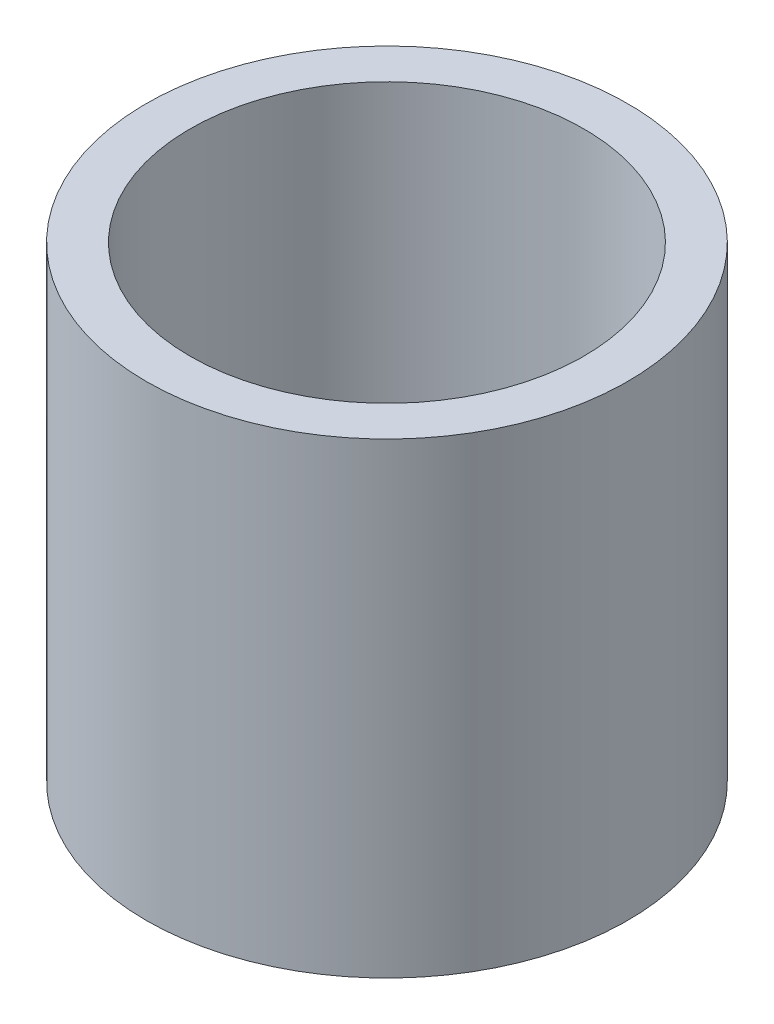
ISO-10303-21;
HEADER;
FILE_DESCRIPTION(('STEP AP214'),'2;1');
FILE_NAME('part.step','',(''),(''),'','','');
FILE_SCHEMA(('AUTOMOTIVE_DESIGN { 1 0 10303 214 1 1 1 1 }'));
ENDSEC;
DATA;
#1=APPLICATION_CONTEXT('core data for automotive mechanical design processes');
#2=APPLICATION_PROTOCOL_DEFINITION('international standard','automotive_design',2000,#1);
#3=PRODUCT_CONTEXT('',#1,'mechanical');
#4=PRODUCT('Part','Part','',(#3));
#5=PRODUCT_RELATED_PRODUCT_CATEGORY('part','',(#4));
#6=PRODUCT_DEFINITION_FORMATION('','',#4);
#7=PRODUCT_DEFINITION_CONTEXT('part definition',#1,'design');
#8=PRODUCT_DEFINITION('design','',#6,#7);
#9=PRODUCT_DEFINITION_SHAPE('','',#8);
#10=(LENGTH_UNIT() NAMED_UNIT(*) SI_UNIT(.MILLI.,.METRE.));
#11=(NAMED_UNIT(*) PLANE_ANGLE_UNIT() SI_UNIT($,.RADIAN.));
#12=(NAMED_UNIT(*) SI_UNIT($,.STERADIAN.) SOLID_ANGLE_UNIT());
#13=UNCERTAINTY_MEASURE_WITH_UNIT(LENGTH_MEASURE(1.E-05),#10,'distance_accuracy_value','');
#14=(GEOMETRIC_REPRESENTATION_CONTEXT(3) GLOBAL_UNCERTAINTY_ASSIGNED_CONTEXT((#13)) GLOBAL_UNIT_ASSIGNED_CONTEXT((#10,
#11,#12)) REPRESENTATION_CONTEXT('',''));
#15=CARTESIAN_POINT('',(0.,0.,0.));
#16=DIRECTION('',(0.,0.,1.));
#17=DIRECTION('',(1.,0.,0.));
#18=AXIS2_PLACEMENT_3D('',#15,#16,#17);
#19=CARTESIAN_POINT('',(52.3875,0.,0.));
#20=DIRECTION('',(0.,-1.,0.));
#21=DIRECTION('',(0.,0.,-1.));
#22=AXIS2_PLACEMENT_3D('',#19,#20,#21);
#23=PLANE('',#22);
#24=CARTESIAN_POINT('',(0.,0.,0.));
#25=DIRECTION('',(0.,1.,0.));
#26=DIRECTION('',(0.,0.,1.));
#27=AXIS2_PLACEMENT_3D('',#24,#25,#26);
#28=CIRCLE('',#27,42.8625);
#29=CARTESIAN_POINT('',(0.,0.,42.8625));
#30=VERTEX_POINT('',#29);
#31=EDGE_CURVE('E10',#30,#30,#28,.T.);
#32=ORIENTED_EDGE('',*,*,#31,.F.);
#33=EDGE_LOOP('',(#32));
#34=FACE_BOUND('',#33,.T.);
#35=CARTESIAN_POINT('',(0.,0.,0.));
#36=DIRECTION('',(0.,1.,0.));
#37=DIRECTION('',(0.,0.,1.));
#38=AXIS2_PLACEMENT_3D('',#35,#36,#37);
#39=CIRCLE('',#38,52.3875);
#40=CARTESIAN_POINT('',(0.,0.,52.3875));
#41=VERTEX_POINT('',#40);
#42=EDGE_CURVE('E55',#41,#41,#39,.T.);
#43=ORIENTED_EDGE('',*,*,#42,.T.);
#44=EDGE_LOOP('',(#43));
#45=FACE_BOUND('',#44,.T.);
#46=ADVANCED_FACE('F37',(#34,#45),#23,.F.);
#47=CARTESIAN_POINT('',(0.,2.54,0.));
#48=DIRECTION('',(0.,1.,0.));
#49=DIRECTION('',(0.,0.,1.));
#50=AXIS2_PLACEMENT_3D('',#47,#48,#49);
#51=CYLINDRICAL_SURFACE('',#50,42.8625);
#52=CARTESIAN_POINT('',(0.,-101.6,0.));
#53=DIRECTION('',(0.,1.,0.));
#54=DIRECTION('',(0.,0.,1.));
#55=AXIS2_PLACEMENT_3D('',#52,#53,#54);
#56=CIRCLE('',#55,42.8625);
#57=CARTESIAN_POINT('',(0.,-101.6,42.8625));
#58=VERTEX_POINT('',#57);
#59=EDGE_CURVE('E44',#58,#58,#56,.T.);
#60=ORIENTED_EDGE('',*,*,#59,.F.);
#61=EDGE_LOOP('',(#60));
#62=FACE_BOUND('',#61,.T.);
#63=ORIENTED_EDGE('',*,*,#31,.T.);
#64=EDGE_LOOP('',(#63));
#65=FACE_BOUND('',#64,.T.);
#66=ADVANCED_FACE('F70',(#62,#65),#51,.F.);
#67=CARTESIAN_POINT('',(42.8625,-101.6,0.));
#68=DIRECTION('',(0.,1.,0.));
#69=DIRECTION('',(0.,0.,1.));
#70=AXIS2_PLACEMENT_3D('',#67,#68,#69);
#71=PLANE('',#70);
#72=CARTESIAN_POINT('',(0.,-101.6,0.));
#73=DIRECTION('',(0.,1.,0.));
#74=DIRECTION('',(0.,0.,1.));
#75=AXIS2_PLACEMENT_3D('',#72,#73,#74);
#76=CIRCLE('',#75,52.3875);
#77=CARTESIAN_POINT('',(0.,-101.6,52.3875));
#78=VERTEX_POINT('',#77);
#79=EDGE_CURVE('E51',#78,#78,#76,.T.);
#80=ORIENTED_EDGE('',*,*,#79,.F.);
#81=EDGE_LOOP('',(#80));
#82=FACE_BOUND('',#81,.T.);
#83=ORIENTED_EDGE('',*,*,#59,.T.);
#84=EDGE_LOOP('',(#83));
#85=FACE_BOUND('',#84,.T.);
#86=ADVANCED_FACE('F65',(#82,#85),#71,.F.);
#87=CARTESIAN_POINT('',(0.,2.54,0.));
#88=DIRECTION('',(0.,1.,0.));
#89=DIRECTION('',(0.,0.,1.));
#90=AXIS2_PLACEMENT_3D('',#87,#88,#89);
#91=CYLINDRICAL_SURFACE('',#90,52.3875);
#92=ORIENTED_EDGE('',*,*,#42,.F.);
#93=EDGE_LOOP('',(#92));
#94=FACE_BOUND('',#93,.T.);
#95=ORIENTED_EDGE('',*,*,#79,.T.);
#96=EDGE_LOOP('',(#95));
#97=FACE_BOUND('',#96,.T.);
#98=ADVANCED_FACE('F62',(#94,#97),#91,.T.);
#99=CLOSED_SHELL('',(#46,#66,#86,#98));
#100=MANIFOLD_SOLID_BREP('B2',#99);
#101=ADVANCED_BREP_SHAPE_REPRESENTATION('',(#18,#100),#14);
#102=SHAPE_DEFINITION_REPRESENTATION(#9,#101);
ENDSEC;
END-ISO-10303-21;
